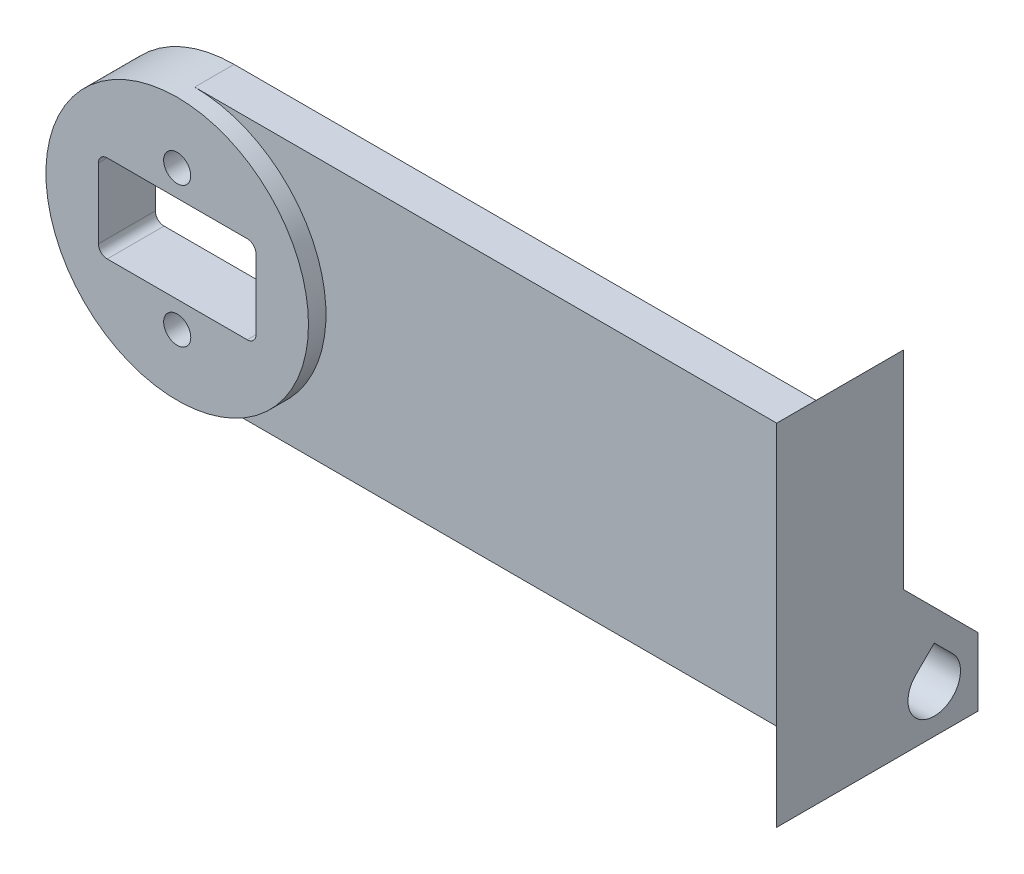
ISO-10303-21;
HEADER;
FILE_DESCRIPTION(('STEP AP214'),'2;1');
FILE_NAME('part.step','',(''),(''),'','','');
FILE_SCHEMA(('AUTOMOTIVE_DESIGN { 1 0 10303 214 1 1 1 1 }'));
ENDSEC;
DATA;
#1=APPLICATION_CONTEXT('core data for automotive mechanical design processes');
#2=APPLICATION_PROTOCOL_DEFINITION('international standard','automotive_design',2000,#1);
#3=PRODUCT_CONTEXT('',#1,'mechanical');
#4=PRODUCT('Part','Part','',(#3));
#5=PRODUCT_RELATED_PRODUCT_CATEGORY('part','',(#4));
#6=PRODUCT_DEFINITION_FORMATION('','',#4);
#7=PRODUCT_DEFINITION_CONTEXT('part definition',#1,'design');
#8=PRODUCT_DEFINITION('design','',#6,#7);
#9=PRODUCT_DEFINITION_SHAPE('','',#8);
#10=(LENGTH_UNIT() NAMED_UNIT(*) SI_UNIT(.MILLI.,.METRE.));
#11=(NAMED_UNIT(*) PLANE_ANGLE_UNIT() SI_UNIT($,.RADIAN.));
#12=(NAMED_UNIT(*) SI_UNIT($,.STERADIAN.) SOLID_ANGLE_UNIT());
#13=UNCERTAINTY_MEASURE_WITH_UNIT(LENGTH_MEASURE(1.E-05),#10,'distance_accuracy_value','');
#14=(GEOMETRIC_REPRESENTATION_CONTEXT(3) GLOBAL_UNCERTAINTY_ASSIGNED_CONTEXT((#13)) GLOBAL_UNIT_ASSIGNED_CONTEXT((#10,
#11,#12)) REPRESENTATION_CONTEXT('',''));
#15=CARTESIAN_POINT('',(0.,0.,0.));
#16=DIRECTION('',(0.,0.,1.));
#17=DIRECTION('',(1.,0.,0.));
#18=AXIS2_PLACEMENT_3D('',#15,#16,#17);
#19=CARTESIAN_POINT('',(-71.5013072163729,800.161947352604,79.4275063549162));
#20=DIRECTION('',(-1.,0.,0.));
#21=DIRECTION('',(0.,0.,1.));
#22=AXIS2_PLACEMENT_3D('',#19,#20,#21);
#23=PLANE('',#22);
#24=CARTESIAN_POINT('',(-71.5013072163729,765.161947352604,75.9275063549163));
#25=DIRECTION('',(-1.,0.,0.));
#26=DIRECTION('',(0.,0.,1.));
#27=AXIS2_PLACEMENT_3D('',#24,#25,#26);
#28=CIRCLE('',#27,3.);
#29=CARTESIAN_POINT('',(-71.5013072163729,767.283267696164,73.8061860113566));
#30=VERTEX_POINT('',#29);
#31=CARTESIAN_POINT('',(-71.5013072163729,767.283267696164,78.0488266984759));
#32=VERTEX_POINT('',#31);
#33=EDGE_CURVE('E52',#30,#32,#28,.T.);
#34=ORIENTED_EDGE('',*,*,#33,.T.);
#35=DIRECTION('',(0.,0.707106781186548,-0.707106781186547));
#36=VECTOR('',#35,1.);
#37=CARTESIAN_POINT('',(-71.5013072163729,769.404588039724,75.9275063549163));
#38=LINE('',#37,#36);
#39=CARTESIAN_POINT('',(-71.5013072163729,769.404588039724,75.9275063549163));
#40=VERTEX_POINT('',#39);
#41=EDGE_CURVE('E326',#32,#40,#38,.T.);
#42=ORIENTED_EDGE('',*,*,#41,.T.);
#43=DIRECTION('',(0.,-0.707106781186548,-0.707106781186547));
#44=VECTOR('',#43,1.);
#45=CARTESIAN_POINT('',(-71.5013072163729,767.283267696164,73.8061860113566));
#46=LINE('',#45,#44);
#47=EDGE_CURVE('E12',#40,#30,#46,.T.);
#48=ORIENTED_EDGE('',*,*,#47,.T.);
#49=EDGE_LOOP('',(#34,#42,#48));
#50=FACE_BOUND('',#49,.T.);
#51=DIRECTION('',(0.,-1.,0.));
#52=VECTOR('',#51,1.);
#53=CARTESIAN_POINT('',(-71.5013072163729,760.161947352604,70.9275063549162));
#54=LINE('',#53,#52);
#55=CARTESIAN_POINT('',(-71.5013072163729,767.940121945656,70.9275063549162));
#56=VERTEX_POINT('',#55);
#57=CARTESIAN_POINT('',(-71.5013072163729,760.161947352604,70.9275063549162));
#58=VERTEX_POINT('',#57);
#59=EDGE_CURVE('E199',#56,#58,#54,.T.);
#60=ORIENTED_EDGE('',*,*,#59,.F.);
#61=DIRECTION('',(0.,-0.707106781186548,-0.707106781186547));
#62=VECTOR('',#61,1.);
#63=CARTESIAN_POINT('',(-71.5013072163729,767.940121945656,70.9275063549162));
#64=LINE('',#63,#62);
#65=CARTESIAN_POINT('',(-71.5013072163729,776.440121945656,79.4275063549162));
#66=VERTEX_POINT('',#65);
#67=EDGE_CURVE('E195',#66,#56,#64,.T.);
#68=ORIENTED_EDGE('',*,*,#67,.F.);
#69=DIRECTION('',(0.,-1.,0.));
#70=VECTOR('',#69,1.);
#71=CARTESIAN_POINT('',(-71.5013072163729,760.161947352604,79.4275063549162));
#72=LINE('',#71,#70);
#73=CARTESIAN_POINT('',(-71.5013072163729,800.161947352604,79.4275063549162));
#74=VERTEX_POINT('',#73);
#75=EDGE_CURVE('E260',#74,#66,#72,.T.);
#76=ORIENTED_EDGE('',*,*,#75,.F.);
#77=DIRECTION('',(0.,0.,-1.));
#78=VECTOR('',#77,1.);
#79=CARTESIAN_POINT('',(-71.5013072163729,800.161947352604,83.9275063549162));
#80=LINE('',#79,#78);
#81=CARTESIAN_POINT('',(-71.5013072163729,800.161947352604,93.9275063549162));
#82=VERTEX_POINT('',#81);
#83=EDGE_CURVE('E327',#74,#82,#80,.F.);
#84=ORIENTED_EDGE('',*,*,#83,.T.);
#85=DIRECTION('',(0.,1.,0.));
#86=VECTOR('',#85,1.);
#87=CARTESIAN_POINT('',(-71.5013072163729,760.161947352604,93.9275063549162));
#88=LINE('',#87,#86);
#89=CARTESIAN_POINT('',(-71.5013072163729,760.161947352604,93.9275063549162));
#90=VERTEX_POINT('',#89);
#91=EDGE_CURVE('E323',#82,#90,#88,.F.);
#92=ORIENTED_EDGE('',*,*,#91,.T.);
#93=DIRECTION('',(0.,0.,1.));
#94=VECTOR('',#93,1.);
#95=CARTESIAN_POINT('',(-71.5013072163729,760.161947352604,84.4275063549162));
#96=LINE('',#95,#94);
#97=EDGE_CURVE('E47',#58,#90,#96,.T.);
#98=ORIENTED_EDGE('',*,*,#97,.F.);
#99=EDGE_LOOP('',(#60,#68,#76,#84,#92,#98));
#100=FACE_BOUND('',#99,.T.);
#101=ADVANCED_FACE('F44',(#50,#100),#23,.F.);
#102=CARTESIAN_POINT('',(-148.001307216373,775.161947352604,85.9275063549162));
#103=DIRECTION('',(0.,0.,1.));
#104=DIRECTION('',(1.,0.,0.));
#105=AXIS2_PLACEMENT_3D('',#102,#103,#104);
#106=PLANE('',#105);
#107=CARTESIAN_POINT('',(-148.001307216373,775.161947352604,85.9275063549162));
#108=DIRECTION('',(0.,0.,-1.));
#109=DIRECTION('',(1.,0.,0.));
#110=AXIS2_PLACEMENT_3D('',#107,#108,#109);
#111=CIRCLE('',#110,15.);
#112=CARTESIAN_POINT('',(-133.001307216373,775.161947352604,85.9275063549162));
#113=VERTEX_POINT('',#112);
#114=EDGE_CURVE('E309',#113,#113,#111,.T.);
#115=ORIENTED_EDGE('',*,*,#114,.F.);
#116=EDGE_LOOP('',(#115));
#117=FACE_BOUND('',#116,.T.);
#118=CARTESIAN_POINT('',(-148.001307216373,767.161947352604,85.9275063549162));
#119=DIRECTION('',(0.,0.,-1.));
#120=DIRECTION('',(1.,0.,0.));
#121=AXIS2_PLACEMENT_3D('',#118,#119,#120);
#122=CIRCLE('',#121,1.54999999999999);
#123=CARTESIAN_POINT('',(-146.451307216373,767.161947352604,85.9275063549162));
#124=VERTEX_POINT('',#123);
#125=EDGE_CURVE('E262',#124,#124,#122,.T.);
#126=ORIENTED_EDGE('',*,*,#125,.T.);
#127=EDGE_LOOP('',(#126));
#128=FACE_BOUND('',#127,.T.);
#129=CARTESIAN_POINT('',(-140.001307216373,771.161947352604,85.9275063549162));
#130=DIRECTION('',(0.,0.,-1.));
#131=DIRECTION('',(1.,0.,0.));
#132=AXIS2_PLACEMENT_3D('',#129,#130,#131);
#133=CIRCLE('',#132,1.);
#134=CARTESIAN_POINT('',(-139.001307216373,771.161947352604,85.9275063549162));
#135=VERTEX_POINT('',#134);
#136=CARTESIAN_POINT('',(-140.001307216373,770.161947352604,85.9275063549162));
#137=VERTEX_POINT('',#136);
#138=EDGE_CURVE('E265',#135,#137,#133,.T.);
#139=ORIENTED_EDGE('',*,*,#138,.T.);
#140=DIRECTION('',(-1.,0.,0.));
#141=VECTOR('',#140,1.);
#142=CARTESIAN_POINT('',(-140.001307216373,770.161947352604,85.9275063549162));
#143=LINE('',#142,#141);
#144=CARTESIAN_POINT('',(-156.001307216373,770.161947352604,85.9275063549162));
#145=VERTEX_POINT('',#144);
#146=EDGE_CURVE('E268',#137,#145,#143,.T.);
#147=ORIENTED_EDGE('',*,*,#146,.T.);
#148=CARTESIAN_POINT('',(-156.001307216373,771.161947352604,85.9275063549162));
#149=DIRECTION('',(0.,0.,-1.));
#150=DIRECTION('',(-1.,0.,0.));
#151=AXIS2_PLACEMENT_3D('',#148,#149,#150);
#152=CIRCLE('',#151,1.);
#153=CARTESIAN_POINT('',(-157.001307216373,771.161947352604,85.9275063549162));
#154=VERTEX_POINT('',#153);
#155=EDGE_CURVE('E271',#145,#154,#152,.T.);
#156=ORIENTED_EDGE('',*,*,#155,.T.);
#157=DIRECTION('',(0.,1.,0.));
#158=VECTOR('',#157,1.);
#159=CARTESIAN_POINT('',(-157.001307216373,771.161947352604,85.9275063549162));
#160=LINE('',#159,#158);
#161=CARTESIAN_POINT('',(-157.001307216373,779.161947352604,85.9275063549162));
#162=VERTEX_POINT('',#161);
#163=EDGE_CURVE('E274',#154,#162,#160,.T.);
#164=ORIENTED_EDGE('',*,*,#163,.T.);
#165=CARTESIAN_POINT('',(-156.001307216373,779.161947352604,85.9275063549162));
#166=DIRECTION('',(0.,0.,-1.));
#167=DIRECTION('',(-1.,0.,0.));
#168=AXIS2_PLACEMENT_3D('',#165,#166,#167);
#169=CIRCLE('',#168,1.);
#170=CARTESIAN_POINT('',(-156.001307216373,780.161947352604,85.9275063549162));
#171=VERTEX_POINT('',#170);
#172=EDGE_CURVE('E277',#162,#171,#169,.T.);
#173=ORIENTED_EDGE('',*,*,#172,.T.);
#174=DIRECTION('',(1.,0.,0.));
#175=VECTOR('',#174,1.);
#176=CARTESIAN_POINT('',(-140.001307216373,780.161947352604,85.9275063549162));
#177=LINE('',#176,#175);
#178=CARTESIAN_POINT('',(-140.001307216373,780.161947352604,85.9275063549162));
#179=VERTEX_POINT('',#178);
#180=EDGE_CURVE('E280',#171,#179,#177,.T.);
#181=ORIENTED_EDGE('',*,*,#180,.T.);
#182=CARTESIAN_POINT('',(-140.001307216373,779.161947352604,85.9275063549162));
#183=DIRECTION('',(0.,0.,-1.));
#184=DIRECTION('',(1.,0.,0.));
#185=AXIS2_PLACEMENT_3D('',#182,#183,#184);
#186=CIRCLE('',#185,1.);
#187=CARTESIAN_POINT('',(-139.001307216373,779.161947352604,85.9275063549162));
#188=VERTEX_POINT('',#187);
#189=EDGE_CURVE('E283',#179,#188,#186,.T.);
#190=ORIENTED_EDGE('',*,*,#189,.T.);
#191=DIRECTION('',(0.,-1.,0.));
#192=VECTOR('',#191,1.);
#193=CARTESIAN_POINT('',(-139.001307216373,771.161947352604,85.9275063549162));
#194=LINE('',#193,#192);
#195=EDGE_CURVE('E286',#188,#135,#194,.T.);
#196=ORIENTED_EDGE('',*,*,#195,.T.);
#197=EDGE_LOOP('',(#139,#147,#156,#164,#173,#181,#190,#196));
#198=FACE_BOUND('',#197,.T.);
#199=CARTESIAN_POINT('',(-148.001307216373,783.161947352604,85.9275063549162));
#200=DIRECTION('',(0.,0.,-1.));
#201=DIRECTION('',(-1.,0.,0.));
#202=AXIS2_PLACEMENT_3D('',#199,#200,#201);
#203=CIRCLE('',#202,1.54999999999999);
#204=CARTESIAN_POINT('',(-149.551307216373,783.161947352604,85.9275063549162));
#205=VERTEX_POINT('',#204);
#206=EDGE_CURVE('E293',#205,#205,#203,.T.);
#207=ORIENTED_EDGE('',*,*,#206,.T.);
#208=EDGE_LOOP('',(#207));
#209=FACE_BOUND('',#208,.T.);
#210=ADVANCED_FACE('F400',(#117,#128,#198,#209),#106,.T.);
#211=CARTESIAN_POINT('',(-140.001307216373,771.161947352604,85.9275063549162));
#212=DIRECTION('',(0.,0.,-1.));
#213=DIRECTION('',(-1.,0.,0.));
#214=AXIS2_PLACEMENT_3D('',#211,#212,#213);
#215=CYLINDRICAL_SURFACE('',#214,1.);
#216=DIRECTION('',(0.,0.,-1.));
#217=VECTOR('',#216,1.);
#218=CARTESIAN_POINT('',(-139.001307216373,771.161947352604,85.9275063549162));
#219=LINE('',#218,#217);
#220=CARTESIAN_POINT('',(-139.001307216373,771.161947352604,79.4275063549162));
#221=VERTEX_POINT('',#220);
#222=EDGE_CURVE('E290',#135,#221,#219,.T.);
#223=ORIENTED_EDGE('',*,*,#222,.T.);
#224=CARTESIAN_POINT('',(-140.001307216373,771.161947352604,79.4275063549162));
#225=DIRECTION('',(0.,0.,-1.));
#226=DIRECTION('',(1.,0.,0.));
#227=AXIS2_PLACEMENT_3D('',#224,#225,#226);
#228=CIRCLE('',#227,1.);
#229=CARTESIAN_POINT('',(-140.001307216373,770.161947352604,79.4275063549162));
#230=VERTEX_POINT('',#229);
#231=EDGE_CURVE('E227',#221,#230,#228,.T.);
#232=ORIENTED_EDGE('',*,*,#231,.T.);
#233=DIRECTION('',(0.,0.,-1.));
#234=VECTOR('',#233,1.);
#235=CARTESIAN_POINT('',(-140.001307216373,770.161947352604,85.9275063549162));
#236=LINE('',#235,#234);
#237=EDGE_CURVE('E289',#137,#230,#236,.T.);
#238=ORIENTED_EDGE('',*,*,#237,.F.);
#239=ORIENTED_EDGE('',*,*,#138,.F.);
#240=EDGE_LOOP('',(#223,#232,#238,#239));
#241=FACE_BOUND('',#240,.T.);
#242=ADVANCED_FACE('F405',(#241),#215,.F.);
#243=CARTESIAN_POINT('',(-140.001307216373,770.161947352604,85.9275063549162));
#244=DIRECTION('',(0.,-1.,0.));
#245=DIRECTION('',(0.,0.,-1.));
#246=AXIS2_PLACEMENT_3D('',#243,#244,#245);
#247=PLANE('',#246);
#248=ORIENTED_EDGE('',*,*,#237,.T.);
#249=DIRECTION('',(-1.,0.,0.));
#250=VECTOR('',#249,1.);
#251=CARTESIAN_POINT('',(-140.001307216373,770.161947352604,79.4275063549162));
#252=LINE('',#251,#250);
#253=CARTESIAN_POINT('',(-156.001307216373,770.161947352604,79.4275063549162));
#254=VERTEX_POINT('',#253);
#255=EDGE_CURVE('E230',#230,#254,#252,.T.);
#256=ORIENTED_EDGE('',*,*,#255,.T.);
#257=DIRECTION('',(0.,0.,-1.));
#258=VECTOR('',#257,1.);
#259=CARTESIAN_POINT('',(-156.001307216373,770.161947352604,85.9275063549162));
#260=LINE('',#259,#258);
#261=EDGE_CURVE('E304',#145,#254,#260,.T.);
#262=ORIENTED_EDGE('',*,*,#261,.F.);
#263=ORIENTED_EDGE('',*,*,#146,.F.);
#264=EDGE_LOOP('',(#248,#256,#262,#263));
#265=FACE_BOUND('',#264,.T.);
#266=ADVANCED_FACE('F455',(#265),#247,.F.);
#267=CARTESIAN_POINT('',(-156.001307216373,771.161947352604,85.9275063549162));
#268=DIRECTION('',(0.,0.,-1.));
#269=DIRECTION('',(-1.,0.,0.));
#270=AXIS2_PLACEMENT_3D('',#267,#268,#269);
#271=CYLINDRICAL_SURFACE('',#270,1.);
#272=ORIENTED_EDGE('',*,*,#261,.T.);
#273=CARTESIAN_POINT('',(-156.001307216373,771.161947352604,79.4275063549162));
#274=DIRECTION('',(0.,0.,-1.));
#275=DIRECTION('',(-1.,0.,0.));
#276=AXIS2_PLACEMENT_3D('',#273,#274,#275);
#277=CIRCLE('',#276,1.);
#278=CARTESIAN_POINT('',(-157.001307216373,771.161947352604,79.4275063549162));
#279=VERTEX_POINT('',#278);
#280=EDGE_CURVE('E233',#254,#279,#277,.T.);
#281=ORIENTED_EDGE('',*,*,#280,.T.);
#282=DIRECTION('',(0.,0.,-1.));
#283=VECTOR('',#282,1.);
#284=CARTESIAN_POINT('',(-157.001307216373,771.161947352604,85.9275063549162));
#285=LINE('',#284,#283);
#286=EDGE_CURVE('E302',#154,#279,#285,.T.);
#287=ORIENTED_EDGE('',*,*,#286,.F.);
#288=ORIENTED_EDGE('',*,*,#155,.F.);
#289=EDGE_LOOP('',(#272,#281,#287,#288));
#290=FACE_BOUND('',#289,.T.);
#291=ADVANCED_FACE('F458',(#290),#271,.F.);
#292=CARTESIAN_POINT('',(-157.001307216373,771.161947352604,85.9275063549162));
#293=DIRECTION('',(-1.,0.,0.));
#294=DIRECTION('',(0.,0.,1.));
#295=AXIS2_PLACEMENT_3D('',#292,#293,#294);
#296=PLANE('',#295);
#297=ORIENTED_EDGE('',*,*,#286,.T.);
#298=DIRECTION('',(0.,1.,0.));
#299=VECTOR('',#298,1.);
#300=CARTESIAN_POINT('',(-157.001307216373,771.161947352604,79.4275063549162));
#301=LINE('',#300,#299);
#302=CARTESIAN_POINT('',(-157.001307216373,779.161947352604,79.4275063549162));
#303=VERTEX_POINT('',#302);
#304=EDGE_CURVE('E236',#279,#303,#301,.T.);
#305=ORIENTED_EDGE('',*,*,#304,.T.);
#306=DIRECTION('',(0.,0.,-1.));
#307=VECTOR('',#306,1.);
#308=CARTESIAN_POINT('',(-157.001307216373,779.161947352604,85.9275063549162));
#309=LINE('',#308,#307);
#310=EDGE_CURVE('E300',#162,#303,#309,.T.);
#311=ORIENTED_EDGE('',*,*,#310,.F.);
#312=ORIENTED_EDGE('',*,*,#163,.F.);
#313=EDGE_LOOP('',(#297,#305,#311,#312));
#314=FACE_BOUND('',#313,.T.);
#315=ADVANCED_FACE('F463',(#314),#296,.F.);
#316=CARTESIAN_POINT('',(-156.001307216373,779.161947352604,85.9275063549162));
#317=DIRECTION('',(0.,0.,-1.));
#318=DIRECTION('',(-1.,0.,0.));
#319=AXIS2_PLACEMENT_3D('',#316,#317,#318);
#320=CYLINDRICAL_SURFACE('',#319,1.);
#321=ORIENTED_EDGE('',*,*,#310,.T.);
#322=CARTESIAN_POINT('',(-156.001307216373,779.161947352604,79.4275063549162));
#323=DIRECTION('',(0.,0.,-1.));
#324=DIRECTION('',(-1.,0.,0.));
#325=AXIS2_PLACEMENT_3D('',#322,#323,#324);
#326=CIRCLE('',#325,1.);
#327=CARTESIAN_POINT('',(-156.001307216373,780.161947352604,79.4275063549162));
#328=VERTEX_POINT('',#327);
#329=EDGE_CURVE('E239',#303,#328,#326,.T.);
#330=ORIENTED_EDGE('',*,*,#329,.T.);
#331=DIRECTION('',(0.,0.,-1.));
#332=VECTOR('',#331,1.);
#333=CARTESIAN_POINT('',(-156.001307216373,780.161947352604,85.9275063549162));
#334=LINE('',#333,#332);
#335=EDGE_CURVE('E298',#171,#328,#334,.T.);
#336=ORIENTED_EDGE('',*,*,#335,.F.);
#337=ORIENTED_EDGE('',*,*,#172,.F.);
#338=EDGE_LOOP('',(#321,#330,#336,#337));
#339=FACE_BOUND('',#338,.T.);
#340=ADVANCED_FACE('F466',(#339),#320,.F.);
#341=CARTESIAN_POINT('',(-140.001307216373,780.161947352604,85.9275063549162));
#342=DIRECTION('',(0.,1.,0.));
#343=DIRECTION('',(0.,0.,1.));
#344=AXIS2_PLACEMENT_3D('',#341,#342,#343);
#345=PLANE('',#344);
#346=ORIENTED_EDGE('',*,*,#335,.T.);
#347=DIRECTION('',(1.,0.,0.));
#348=VECTOR('',#347,1.);
#349=CARTESIAN_POINT('',(-140.001307216373,780.161947352604,79.4275063549162));
#350=LINE('',#349,#348);
#351=CARTESIAN_POINT('',(-140.001307216373,780.161947352604,79.4275063549162));
#352=VERTEX_POINT('',#351);
#353=EDGE_CURVE('E242',#328,#352,#350,.T.);
#354=ORIENTED_EDGE('',*,*,#353,.T.);
#355=DIRECTION('',(0.,0.,-1.));
#356=VECTOR('',#355,1.);
#357=CARTESIAN_POINT('',(-140.001307216373,780.161947352604,85.9275063549162));
#358=LINE('',#357,#356);
#359=EDGE_CURVE('E296',#179,#352,#358,.T.);
#360=ORIENTED_EDGE('',*,*,#359,.F.);
#361=ORIENTED_EDGE('',*,*,#180,.F.);
#362=EDGE_LOOP('',(#346,#354,#360,#361));
#363=FACE_BOUND('',#362,.T.);
#364=ADVANCED_FACE('F470',(#363),#345,.F.);
#365=CARTESIAN_POINT('',(-140.001307216373,779.161947352604,85.9275063549162));
#366=DIRECTION('',(0.,0.,-1.));
#367=DIRECTION('',(-1.,0.,0.));
#368=AXIS2_PLACEMENT_3D('',#365,#366,#367);
#369=CYLINDRICAL_SURFACE('',#368,1.);
#370=ORIENTED_EDGE('',*,*,#359,.T.);
#371=CARTESIAN_POINT('',(-140.001307216373,779.161947352604,79.4275063549162));
#372=DIRECTION('',(0.,0.,-1.));
#373=DIRECTION('',(1.,0.,0.));
#374=AXIS2_PLACEMENT_3D('',#371,#372,#373);
#375=CIRCLE('',#374,1.);
#376=CARTESIAN_POINT('',(-139.001307216373,779.161947352604,79.4275063549162));
#377=VERTEX_POINT('',#376);
#378=EDGE_CURVE('E245',#352,#377,#375,.T.);
#379=ORIENTED_EDGE('',*,*,#378,.T.);
#380=DIRECTION('',(0.,0.,-1.));
#381=VECTOR('',#380,1.);
#382=CARTESIAN_POINT('',(-139.001307216373,779.161947352604,85.9275063549162));
#383=LINE('',#382,#381);
#384=EDGE_CURVE('E294',#188,#377,#383,.T.);
#385=ORIENTED_EDGE('',*,*,#384,.F.);
#386=ORIENTED_EDGE('',*,*,#189,.F.);
#387=EDGE_LOOP('',(#370,#379,#385,#386));
#388=FACE_BOUND('',#387,.T.);
#389=ADVANCED_FACE('F434',(#388),#369,.F.);
#390=CARTESIAN_POINT('',(-148.001307216373,783.161947352604,85.9275063549162));
#391=DIRECTION('',(0.,0.,-1.));
#392=DIRECTION('',(-1.,0.,0.));
#393=AXIS2_PLACEMENT_3D('',#390,#391,#392);
#394=CYLINDRICAL_SURFACE('',#393,1.54999999999999);
#395=ORIENTED_EDGE('',*,*,#206,.F.);
#396=EDGE_LOOP('',(#395));
#397=FACE_BOUND('',#396,.T.);
#398=CARTESIAN_POINT('',(-148.001307216373,783.161947352604,79.4275063549162));
#399=DIRECTION('',(0.,0.,-1.));
#400=DIRECTION('',(-1.,0.,0.));
#401=AXIS2_PLACEMENT_3D('',#398,#399,#400);
#402=CIRCLE('',#401,1.54999999999999);
#403=CARTESIAN_POINT('',(-149.551307216373,783.161947352604,79.4275063549162));
#404=VERTEX_POINT('',#403);
#405=EDGE_CURVE('E249',#404,#404,#402,.T.);
#406=ORIENTED_EDGE('',*,*,#405,.T.);
#407=EDGE_LOOP('',(#406));
#408=FACE_BOUND('',#407,.T.);
#409=ADVANCED_FACE('F425',(#397,#408),#394,.F.);
#410=CARTESIAN_POINT('',(-148.001307216373,767.161947352604,85.9275063549162));
#411=DIRECTION('',(0.,0.,-1.));
#412=DIRECTION('',(-1.,0.,0.));
#413=AXIS2_PLACEMENT_3D('',#410,#411,#412);
#414=CYLINDRICAL_SURFACE('',#413,1.54999999999999);
#415=ORIENTED_EDGE('',*,*,#125,.F.);
#416=EDGE_LOOP('',(#415));
#417=FACE_BOUND('',#416,.T.);
#418=CARTESIAN_POINT('',(-148.001307216373,767.161947352604,79.4275063549162));
#419=DIRECTION('',(0.,0.,-1.));
#420=DIRECTION('',(1.,0.,0.));
#421=AXIS2_PLACEMENT_3D('',#418,#419,#420);
#422=CIRCLE('',#421,1.54999999999999);
#423=CARTESIAN_POINT('',(-146.451307216373,767.161947352604,79.4275063549162));
#424=VERTEX_POINT('',#423);
#425=EDGE_CURVE('E224',#424,#424,#422,.T.);
#426=ORIENTED_EDGE('',*,*,#425,.T.);
#427=EDGE_LOOP('',(#426));
#428=FACE_BOUND('',#427,.T.);
#429=ADVANCED_FACE('F423',(#417,#428),#414,.F.);
#430=CARTESIAN_POINT('',(-148.001307216373,775.161947352604,85.9275063549162));
#431=DIRECTION('',(0.,0.,-1.));
#432=DIRECTION('',(-1.,0.,0.));
#433=AXIS2_PLACEMENT_3D('',#430,#431,#432);
#434=CYLINDRICAL_SURFACE('',#433,15.);
#435=CARTESIAN_POINT('',(-148.001307216373,775.161947352604,83.9275063549162));
#436=DIRECTION('',(0.,0.,-1.));
#437=DIRECTION('',(-1.,0.,0.));
#438=AXIS2_PLACEMENT_3D('',#435,#436,#437);
#439=CIRCLE('',#438,14.9999999999999);
#440=CARTESIAN_POINT('',(-148.001307216373,790.161947352604,83.9275063549162));
#441=VERTEX_POINT('',#440);
#442=CARTESIAN_POINT('',(-148.001307216373,760.161947352604,83.9275063549162));
#443=VERTEX_POINT('',#442);
#444=EDGE_CURVE('E217',#441,#443,#439,.T.);
#445=ORIENTED_EDGE('',*,*,#444,.F.);
#446=DIRECTION('',(0.,0.,-1.));
#447=VECTOR('',#446,1.);
#448=CARTESIAN_POINT('',(-148.001307216373,790.161947352604,85.9275063549162));
#449=LINE('',#448,#447);
#450=CARTESIAN_POINT('',(-148.001307216373,790.161947352604,79.4275063549162));
#451=VERTEX_POINT('',#450);
#452=EDGE_CURVE('E313',#441,#451,#449,.T.);
#453=ORIENTED_EDGE('',*,*,#452,.T.);
#454=CARTESIAN_POINT('',(-148.001307216373,775.161947352604,79.4275063549162));
#455=DIRECTION('',(0.,0.,-1.));
#456=DIRECTION('',(1.,0.,0.));
#457=AXIS2_PLACEMENT_3D('',#454,#455,#456);
#458=CIRCLE('',#457,15.);
#459=CARTESIAN_POINT('',(-148.001307216373,760.161947352604,79.4275063549162));
#460=VERTEX_POINT('',#459);
#461=EDGE_CURVE('E254',#460,#451,#458,.T.);
#462=ORIENTED_EDGE('',*,*,#461,.F.);
#463=DIRECTION('',(0.,0.,-1.));
#464=VECTOR('',#463,1.);
#465=CARTESIAN_POINT('',(-148.001307216373,760.161947352604,85.9275063549162));
#466=LINE('',#465,#464);
#467=EDGE_CURVE('E312',#443,#460,#466,.T.);
#468=ORIENTED_EDGE('',*,*,#467,.F.);
#469=EDGE_LOOP('',(#445,#453,#462,#468));
#470=FACE_BOUND('',#469,.T.);
#471=ORIENTED_EDGE('',*,*,#114,.T.);
#472=EDGE_LOOP('',(#471));
#473=FACE_BOUND('',#472,.T.);
#474=ADVANCED_FACE('F359',(#470,#473),#434,.T.);
#475=CARTESIAN_POINT('',(-157.36510225122,767.940121945656,70.9275063549162));
#476=DIRECTION('',(0.,-0.707106781186547,0.707106781186548));
#477=DIRECTION('',(0.,-0.707106781186548,-0.707106781186547));
#478=AXIS2_PLACEMENT_3D('',#475,#476,#477);
#479=PLANE('',#478);
#480=DIRECTION('',(1.,0.,0.));
#481=VECTOR('',#480,1.);
#482=CARTESIAN_POINT('',(-157.36510225122,767.940121945656,70.9275063549162));
#483=LINE('',#482,#481);
#484=CARTESIAN_POINT('',(-139.001307216373,767.940121945656,70.9275063549162));
#485=VERTEX_POINT('',#484);
#486=EDGE_CURVE('E192',#485,#56,#483,.T.);
#487=ORIENTED_EDGE('',*,*,#486,.F.);
#488=DIRECTION('',(0.,0.707106781186548,0.707106781186547));
#489=VECTOR('',#488,1.);
#490=CARTESIAN_POINT('',(-139.001307216373,767.940121945656,70.9275063549162));
#491=LINE('',#490,#489);
#492=CARTESIAN_POINT('',(-139.001307216373,776.440121945656,79.4275063549162));
#493=VERTEX_POINT('',#492);
#494=EDGE_CURVE('E176',#485,#493,#491,.T.);
#495=ORIENTED_EDGE('',*,*,#494,.T.);
#496=DIRECTION('',(1.,0.,0.));
#497=VECTOR('',#496,1.);
#498=CARTESIAN_POINT('',(-157.36510225122,776.440121945656,79.4275063549162));
#499=LINE('',#498,#497);
#500=EDGE_CURVE('E188',#493,#66,#499,.T.);
#501=ORIENTED_EDGE('',*,*,#500,.T.);
#502=ORIENTED_EDGE('',*,*,#67,.T.);
#503=EDGE_LOOP('',(#487,#495,#501,#502));
#504=FACE_BOUND('',#503,.T.);
#505=ADVANCED_FACE('F193',(#504),#479,.F.);
#506=CARTESIAN_POINT('',(-157.36510225122,769.404588039724,75.9275063549163));
#507=DIRECTION('',(0.,-0.707106781186547,-0.707106781186548));
#508=DIRECTION('',(0.,0.707106781186548,-0.707106781186547));
#509=AXIS2_PLACEMENT_3D('',#506,#507,#508);
#510=PLANE('',#509);
#511=DIRECTION('',(0.,-0.707106781186548,0.707106781186547));
#512=VECTOR('',#511,1.);
#513=CARTESIAN_POINT('',(-139.001307216373,769.404588039724,75.9275063549163));
#514=LINE('',#513,#512);
#515=CARTESIAN_POINT('',(-139.001307216373,769.404588039724,75.9275063549163));
#516=VERTEX_POINT('',#515);
#517=CARTESIAN_POINT('',(-139.001307216373,767.283267696164,78.0488266984759));
#518=VERTEX_POINT('',#517);
#519=EDGE_CURVE('E215',#516,#518,#514,.T.);
#520=ORIENTED_EDGE('',*,*,#519,.F.);
#521=DIRECTION('',(1.,0.,0.));
#522=VECTOR('',#521,1.);
#523=CARTESIAN_POINT('',(-157.36510225122,769.404588039724,75.9275063549163));
#524=LINE('',#523,#522);
#525=EDGE_CURVE('E375',#516,#40,#524,.T.);
#526=ORIENTED_EDGE('',*,*,#525,.T.);
#527=ORIENTED_EDGE('',*,*,#41,.F.);
#528=DIRECTION('',(1.,0.,0.));
#529=VECTOR('',#528,1.);
#530=CARTESIAN_POINT('',(-157.36510225122,767.283267696164,78.0488266984759));
#531=LINE('',#530,#529);
#532=EDGE_CURVE('E372',#518,#32,#531,.T.);
#533=ORIENTED_EDGE('',*,*,#532,.F.);
#534=EDGE_LOOP('',(#520,#526,#527,#533));
#535=FACE_BOUND('',#534,.T.);
#536=ADVANCED_FACE('F386',(#535),#510,.T.);
#537=CARTESIAN_POINT('',(-157.36510225122,765.161947352604,75.9275063549163));
#538=DIRECTION('',(1.,0.,0.));
#539=DIRECTION('',(0.,0.,-1.));
#540=AXIS2_PLACEMENT_3D('',#537,#538,#539);
#541=CYLINDRICAL_SURFACE('',#540,3.);
#542=CARTESIAN_POINT('',(-139.001307216373,765.161947352604,75.9275063549163));
#543=DIRECTION('',(1.,0.,0.));
#544=DIRECTION('',(0.,0.,-1.));
#545=AXIS2_PLACEMENT_3D('',#542,#543,#544);
#546=CIRCLE('',#545,3.);
#547=CARTESIAN_POINT('',(-139.001307216373,767.283267696164,73.8061860113566));
#548=VERTEX_POINT('',#547);
#549=EDGE_CURVE('E211',#518,#548,#546,.T.);
#550=ORIENTED_EDGE('',*,*,#549,.F.);
#551=ORIENTED_EDGE('',*,*,#532,.T.);
#552=ORIENTED_EDGE('',*,*,#33,.F.);
#553=DIRECTION('',(1.,0.,0.));
#554=VECTOR('',#553,1.);
#555=CARTESIAN_POINT('',(-157.36510225122,767.283267696164,73.8061860113566));
#556=LINE('',#555,#554);
#557=EDGE_CURVE('E214',#548,#30,#556,.T.);
#558=ORIENTED_EDGE('',*,*,#557,.F.);
#559=EDGE_LOOP('',(#550,#551,#552,#558));
#560=FACE_BOUND('',#559,.T.);
#561=ADVANCED_FACE('F382',(#560),#541,.F.);
#562=CARTESIAN_POINT('',(-139.001307216373,771.161947352604,85.9275063549162));
#563=DIRECTION('',(1.,0.,0.));
#564=DIRECTION('',(0.,0.,-1.));
#565=AXIS2_PLACEMENT_3D('',#562,#563,#564);
#566=PLANE('',#565);
#567=ORIENTED_EDGE('',*,*,#384,.T.);
#568=DIRECTION('',(0.,-1.,0.));
#569=VECTOR('',#568,1.);
#570=CARTESIAN_POINT('',(-139.001307216373,771.161947352604,79.4275063549162));
#571=LINE('',#570,#569);
#572=EDGE_CURVE('E184',#377,#493,#571,.T.);
#573=ORIENTED_EDGE('',*,*,#572,.T.);
#574=ORIENTED_EDGE('',*,*,#494,.F.);
#575=DIRECTION('',(0.,1.,0.));
#576=VECTOR('',#575,1.);
#577=CARTESIAN_POINT('',(-139.001307216373,760.161947352604,70.9275063549162));
#578=LINE('',#577,#576);
#579=CARTESIAN_POINT('',(-139.001307216373,760.161947352604,70.9275063549162));
#580=VERTEX_POINT('',#579);
#581=EDGE_CURVE('E181',#580,#485,#578,.T.);
#582=ORIENTED_EDGE('',*,*,#581,.F.);
#583=DIRECTION('',(0.,0.,-1.));
#584=VECTOR('',#583,1.);
#585=CARTESIAN_POINT('',(-139.001307216373,760.161947352604,79.4275063549162));
#586=LINE('',#585,#584);
#587=CARTESIAN_POINT('',(-139.001307216373,760.161947352604,79.4275063549162));
#588=VERTEX_POINT('',#587);
#589=EDGE_CURVE('E209',#588,#580,#586,.T.);
#590=ORIENTED_EDGE('',*,*,#589,.F.);
#591=DIRECTION('',(0.,1.,0.));
#592=VECTOR('',#591,1.);
#593=CARTESIAN_POINT('',(-139.001307216373,775.161947352604,79.4275063549162));
#594=LINE('',#593,#592);
#595=EDGE_CURVE('E315',#588,#221,#594,.T.);
#596=ORIENTED_EDGE('',*,*,#595,.T.);
#597=ORIENTED_EDGE('',*,*,#222,.F.);
#598=ORIENTED_EDGE('',*,*,#195,.F.);
#599=EDGE_LOOP('',(#567,#573,#574,#582,#590,#596,#597,#598));
#600=FACE_BOUND('',#599,.T.);
#601=ORIENTED_EDGE('',*,*,#549,.T.);
#602=DIRECTION('',(0.,0.707106781186548,0.707106781186547));
#603=VECTOR('',#602,1.);
#604=CARTESIAN_POINT('',(-139.001307216373,767.283267696164,73.8061860113566));
#605=LINE('',#604,#603);
#606=EDGE_CURVE('E213',#548,#516,#605,.T.);
#607=ORIENTED_EDGE('',*,*,#606,.T.);
#608=ORIENTED_EDGE('',*,*,#519,.T.);
#609=EDGE_LOOP('',(#601,#607,#608));
#610=FACE_BOUND('',#609,.T.);
#611=ADVANCED_FACE('F178',(#600,#610),#566,.F.);
#612=CARTESIAN_POINT('',(-157.36510225122,767.283267696164,73.8061860113566));
#613=DIRECTION('',(0.,-0.707106781186547,0.707106781186548));
#614=DIRECTION('',(0.,-0.707106781186548,-0.707106781186547));
#615=AXIS2_PLACEMENT_3D('',#612,#613,#614);
#616=PLANE('',#615);
#617=ORIENTED_EDGE('',*,*,#606,.F.);
#618=ORIENTED_EDGE('',*,*,#557,.T.);
#619=ORIENTED_EDGE('',*,*,#47,.F.);
#620=ORIENTED_EDGE('',*,*,#525,.F.);
#621=EDGE_LOOP('',(#617,#618,#619,#620));
#622=FACE_BOUND('',#621,.T.);
#623=ADVANCED_FACE('F379',(#622),#616,.T.);
#624=CARTESIAN_POINT('',(-148.001307216373,775.161947352604,83.9275063549162));
#625=DIRECTION('',(0.,0.,-1.));
#626=DIRECTION('',(-1.,0.,0.));
#627=AXIS2_PLACEMENT_3D('',#624,#625,#626);
#628=PLANE('',#627);
#629=DIRECTION('',(1.,0.,0.));
#630=VECTOR('',#629,1.);
#631=CARTESIAN_POINT('',(-71.5013072163729,760.161947352604,83.9275063549162));
#632=LINE('',#631,#630);
#633=CARTESIAN_POINT('',(-81.5013072163729,760.161947352604,83.9275063549162));
#634=VERTEX_POINT('',#633);
#635=EDGE_CURVE('E219',#443,#634,#632,.T.);
#636=ORIENTED_EDGE('',*,*,#635,.T.);
#637=DIRECTION('',(0.,1.,0.));
#638=VECTOR('',#637,1.);
#639=CARTESIAN_POINT('',(-81.5013072163729,775.161947352604,83.9275063549162));
#640=LINE('',#639,#638);
#641=CARTESIAN_POINT('',(-81.5013072163729,790.161947352604,83.9275063549162));
#642=VERTEX_POINT('',#641);
#643=EDGE_CURVE('E322',#634,#642,#640,.T.);
#644=ORIENTED_EDGE('',*,*,#643,.T.);
#645=DIRECTION('',(-1.,0.,0.));
#646=VECTOR('',#645,1.);
#647=CARTESIAN_POINT('',(-148.001307216373,790.161947352604,83.9275063549162));
#648=LINE('',#647,#646);
#649=EDGE_CURVE('E222',#642,#441,#648,.T.);
#650=ORIENTED_EDGE('',*,*,#649,.T.);
#651=ORIENTED_EDGE('',*,*,#444,.T.);
#652=EDGE_LOOP('',(#636,#644,#650,#651));
#653=FACE_BOUND('',#652,.T.);
#654=ADVANCED_FACE('F355',(#653),#628,.F.);
#655=CARTESIAN_POINT('',(31.9986927836271,760.161947352604,84.4275063549162));
#656=DIRECTION('',(0.,1.,0.));
#657=DIRECTION('',(0.,0.,1.));
#658=AXIS2_PLACEMENT_3D('',#655,#656,#657);
#659=PLANE('',#658);
#660=DIRECTION('',(1.,0.,0.));
#661=VECTOR('',#660,1.);
#662=CARTESIAN_POINT('',(-157.36510225122,760.161947352604,70.9275063549162));
#663=LINE('',#662,#661);
#664=EDGE_CURVE('E203',#580,#58,#663,.T.);
#665=ORIENTED_EDGE('',*,*,#664,.T.);
#666=ORIENTED_EDGE('',*,*,#97,.T.);
#667=CARTESIAN_POINT('',(-81.5013072163729,760.161947352604,93.9275063549162));
#668=DIRECTION('',(0.,1.,0.));
#669=DIRECTION('',(0.,0.,1.));
#670=AXIS2_PLACEMENT_3D('',#667,#668,#669);
#671=CIRCLE('',#670,10.);
#672=EDGE_CURVE('E334',#90,#634,#671,.T.);
#673=ORIENTED_EDGE('',*,*,#672,.T.);
#674=ORIENTED_EDGE('',*,*,#635,.F.);
#675=ORIENTED_EDGE('',*,*,#467,.T.);
#676=DIRECTION('',(-1.,0.,0.));
#677=VECTOR('',#676,1.);
#678=CARTESIAN_POINT('',(-148.001307216373,760.161947352604,79.4275063549162));
#679=LINE('',#678,#677);
#680=EDGE_CURVE('E252',#588,#460,#679,.T.);
#681=ORIENTED_EDGE('',*,*,#680,.F.);
#682=ORIENTED_EDGE('',*,*,#589,.T.);
#683=EDGE_LOOP('',(#665,#666,#673,#674,#675,#681,#682));
#684=FACE_BOUND('',#683,.T.);
#685=ADVANCED_FACE('F364',(#684),#659,.F.);
#686=CARTESIAN_POINT('',(-148.001307216373,790.161947352604,85.9275063549162));
#687=DIRECTION('',(0.,1.,0.));
#688=DIRECTION('',(-1.,0.,0.));
#689=AXIS2_PLACEMENT_3D('',#686,#687,#688);
#690=PLANE('',#689);
#691=ORIENTED_EDGE('',*,*,#649,.F.);
#692=DIRECTION('',(0.,0.,-1.));
#693=VECTOR('',#692,1.);
#694=CARTESIAN_POINT('',(-81.5013072163729,790.161947352604,79.4275063549162));
#695=LINE('',#694,#693);
#696=CARTESIAN_POINT('',(-81.5013072163729,790.161947352604,79.4275063549162));
#697=VERTEX_POINT('',#696);
#698=EDGE_CURVE('E319',#642,#697,#695,.T.);
#699=ORIENTED_EDGE('',*,*,#698,.T.);
#700=DIRECTION('',(1.,0.,0.));
#701=VECTOR('',#700,1.);
#702=CARTESIAN_POINT('',(-148.001307216373,790.161947352604,79.4275063549162));
#703=LINE('',#702,#701);
#704=EDGE_CURVE('E257',#451,#697,#703,.T.);
#705=ORIENTED_EDGE('',*,*,#704,.F.);
#706=ORIENTED_EDGE('',*,*,#452,.F.);
#707=EDGE_LOOP('',(#691,#699,#705,#706));
#708=FACE_BOUND('',#707,.T.);
#709=ADVANCED_FACE('F351',(#708),#690,.T.);
#710=CARTESIAN_POINT('',(-148.001307216373,775.161947352604,79.4275063549162));
#711=DIRECTION('',(0.,0.,1.));
#712=DIRECTION('',(1.,0.,0.));
#713=AXIS2_PLACEMENT_3D('',#710,#711,#712);
#714=PLANE('',#713);
#715=ORIENTED_EDGE('',*,*,#425,.F.);
#716=EDGE_LOOP('',(#715));
#717=FACE_BOUND('',#716,.T.);
#718=ORIENTED_EDGE('',*,*,#405,.F.);
#719=EDGE_LOOP('',(#718));
#720=FACE_BOUND('',#719,.T.);
#721=ORIENTED_EDGE('',*,*,#500,.F.);
#722=ORIENTED_EDGE('',*,*,#572,.F.);
#723=ORIENTED_EDGE('',*,*,#378,.F.);
#724=ORIENTED_EDGE('',*,*,#353,.F.);
#725=ORIENTED_EDGE('',*,*,#329,.F.);
#726=ORIENTED_EDGE('',*,*,#304,.F.);
#727=ORIENTED_EDGE('',*,*,#280,.F.);
#728=ORIENTED_EDGE('',*,*,#255,.F.);
#729=ORIENTED_EDGE('',*,*,#231,.F.);
#730=ORIENTED_EDGE('',*,*,#595,.F.);
#731=ORIENTED_EDGE('',*,*,#680,.T.);
#732=ORIENTED_EDGE('',*,*,#461,.T.);
#733=ORIENTED_EDGE('',*,*,#704,.T.);
#734=CARTESIAN_POINT('',(-81.5013072163729,800.161947352604,79.4275063549162));
#735=DIRECTION('',(0.,0.,1.));
#736=DIRECTION('',(1.,0.,0.));
#737=AXIS2_PLACEMENT_3D('',#734,#735,#736);
#738=CIRCLE('',#737,10.);
#739=EDGE_CURVE('E331',#697,#74,#738,.T.);
#740=ORIENTED_EDGE('',*,*,#739,.T.);
#741=ORIENTED_EDGE('',*,*,#75,.T.);
#742=EDGE_LOOP('',(#721,#722,#723,#724,#725,#726,#727,#728,#729,#730,#731,#732,#733,#740,#741));
#743=FACE_BOUND('',#742,.T.);
#744=ADVANCED_FACE('F347',(#717,#720,#743),#714,.F.);
#745=CARTESIAN_POINT('',(-81.5013072163729,775.161947352604,93.9275063549162));
#746=DIRECTION('',(0.,1.,0.));
#747=DIRECTION('',(0.,0.,1.));
#748=AXIS2_PLACEMENT_3D('',#745,#746,#747);
#749=CYLINDRICAL_SURFACE('',#748,10.);
#750=ORIENTED_EDGE('',*,*,#672,.F.);
#751=ORIENTED_EDGE('',*,*,#91,.F.);
#752=CARTESIAN_POINT('',(-81.5013072163729,800.161947352604,93.9275063549162));
#753=DIRECTION('',(0.,0.707106781186547,-0.707106781186547));
#754=DIRECTION('',(0.,0.707106781186547,0.707106781186547));
#755=AXIS2_PLACEMENT_3D('',#752,#753,#754);
#756=ELLIPSE('',#755,14.1421356237309,10.);
#757=EDGE_CURVE('E189',#642,#82,#756,.F.);
#758=ORIENTED_EDGE('',*,*,#757,.F.);
#759=ORIENTED_EDGE('',*,*,#643,.F.);
#760=EDGE_LOOP('',(#750,#751,#758,#759));
#761=FACE_BOUND('',#760,.T.);
#762=ADVANCED_FACE('F344',(#761),#749,.F.);
#763=CARTESIAN_POINT('',(-81.5013072163729,800.161947352604,85.9275063549162));
#764=DIRECTION('',(0.,0.,1.));
#765=DIRECTION('',(1.,0.,0.));
#766=AXIS2_PLACEMENT_3D('',#763,#764,#765);
#767=CYLINDRICAL_SURFACE('',#766,10.);
#768=ORIENTED_EDGE('',*,*,#757,.T.);
#769=ORIENTED_EDGE('',*,*,#83,.F.);
#770=ORIENTED_EDGE('',*,*,#739,.F.);
#771=ORIENTED_EDGE('',*,*,#698,.F.);
#772=EDGE_LOOP('',(#768,#769,#770,#771));
#773=FACE_BOUND('',#772,.T.);
#774=ADVANCED_FACE('F339',(#773),#767,.F.);
#775=CARTESIAN_POINT('',(-157.36510225122,760.161947352604,70.9275063549162));
#776=DIRECTION('',(0.,0.,1.));
#777=DIRECTION('',(0.,-1.,0.));
#778=AXIS2_PLACEMENT_3D('',#775,#776,#777);
#779=PLANE('',#778);
#780=ORIENTED_EDGE('',*,*,#664,.F.);
#781=ORIENTED_EDGE('',*,*,#581,.T.);
#782=ORIENTED_EDGE('',*,*,#486,.T.);
#783=ORIENTED_EDGE('',*,*,#59,.T.);
#784=EDGE_LOOP('',(#780,#781,#782,#783));
#785=FACE_BOUND('',#784,.T.);
#786=ADVANCED_FACE('F201',(#785),#779,.F.);
#787=CLOSED_SHELL('',(#101,#210,#242,#266,#291,#315,#340,#364,#389,#409,#429,#474,#505,#536,
#561,#611,#623,#654,#685,#709,#744,#762,#774,#786));
#788=MANIFOLD_SOLID_BREP('B2',#787);
#789=ADVANCED_BREP_SHAPE_REPRESENTATION('',(#18,#788),#14);
#790=SHAPE_DEFINITION_REPRESENTATION(#9,#789);
ENDSEC;
END-ISO-10303-21;
